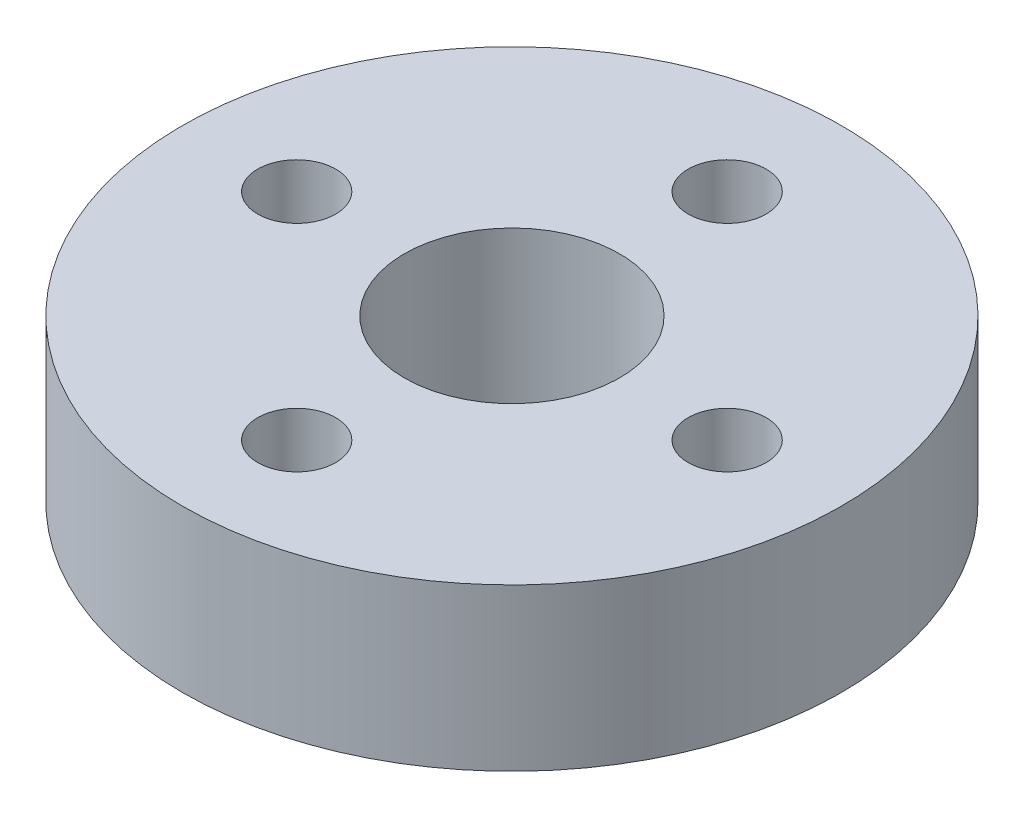
ISO-10303-21;
HEADER;
FILE_DESCRIPTION(('STEP AP214'),'2;1');
FILE_NAME('part.step','',(''),(''),'','','');
FILE_SCHEMA(('AUTOMOTIVE_DESIGN { 1 0 10303 214 1 1 1 1 }'));
ENDSEC;
DATA;
#1=APPLICATION_CONTEXT('core data for automotive mechanical design processes');
#2=APPLICATION_PROTOCOL_DEFINITION('international standard','automotive_design',2000,#1);
#3=PRODUCT_CONTEXT('',#1,'mechanical');
#4=PRODUCT('Part','Part','',(#3));
#5=PRODUCT_RELATED_PRODUCT_CATEGORY('part','',(#4));
#6=PRODUCT_DEFINITION_FORMATION('','',#4);
#7=PRODUCT_DEFINITION_CONTEXT('part definition',#1,'design');
#8=PRODUCT_DEFINITION('design','',#6,#7);
#9=PRODUCT_DEFINITION_SHAPE('','',#8);
#10=(LENGTH_UNIT() NAMED_UNIT(*) SI_UNIT(.MILLI.,.METRE.));
#11=(NAMED_UNIT(*) PLANE_ANGLE_UNIT() SI_UNIT($,.RADIAN.));
#12=(NAMED_UNIT(*) SI_UNIT($,.STERADIAN.) SOLID_ANGLE_UNIT());
#13=UNCERTAINTY_MEASURE_WITH_UNIT(LENGTH_MEASURE(1.E-05),#10,'distance_accuracy_value','');
#14=(GEOMETRIC_REPRESENTATION_CONTEXT(3) GLOBAL_UNCERTAINTY_ASSIGNED_CONTEXT((#13)) GLOBAL_UNIT_ASSIGNED_CONTEXT((#10,
#11,#12)) REPRESENTATION_CONTEXT('',''));
#15=CARTESIAN_POINT('',(0.,0.,0.));
#16=DIRECTION('',(0.,0.,1.));
#17=DIRECTION('',(1.,0.,0.));
#18=AXIS2_PLACEMENT_3D('',#15,#16,#17);
#19=CARTESIAN_POINT('',(0.,6.,0.));
#20=DIRECTION('',(0.,1.,0.));
#21=DIRECTION('',(0.,0.,1.));
#22=AXIS2_PLACEMENT_3D('',#19,#20,#21);
#23=PLANE('',#22);
#24=CARTESIAN_POINT('',(0.,6.,8.));
#25=DIRECTION('',(0.,1.,0.));
#26=DIRECTION('',(0.,0.,1.));
#27=AXIS2_PLACEMENT_3D('',#24,#25,#26);
#28=CIRCLE('',#27,1.45);
#29=CARTESIAN_POINT('',(0.,6.,9.45));
#30=VERTEX_POINT('',#29);
#31=EDGE_CURVE('E72',#30,#30,#28,.T.);
#32=ORIENTED_EDGE('',*,*,#31,.F.);
#33=EDGE_LOOP('',(#32));
#34=FACE_BOUND('',#33,.T.);
#35=CARTESIAN_POINT('',(0.,6.,-8.));
#36=DIRECTION('',(0.,1.,0.));
#37=DIRECTION('',(0.,0.,1.));
#38=AXIS2_PLACEMENT_3D('',#35,#36,#37);
#39=CIRCLE('',#38,1.45);
#40=CARTESIAN_POINT('',(0.,6.,-6.55));
#41=VERTEX_POINT('',#40);
#42=EDGE_CURVE('E56',#41,#41,#39,.T.);
#43=ORIENTED_EDGE('',*,*,#42,.F.);
#44=EDGE_LOOP('',(#43));
#45=FACE_BOUND('',#44,.T.);
#46=CARTESIAN_POINT('',(0.,6.,0.));
#47=DIRECTION('',(0.,1.,0.));
#48=DIRECTION('',(0.,0.,1.));
#49=AXIS2_PLACEMENT_3D('',#46,#47,#48);
#50=CIRCLE('',#49,12.25);
#51=CARTESIAN_POINT('',(0.,6.,12.25));
#52=VERTEX_POINT('',#51);
#53=EDGE_CURVE('E10',#52,#52,#50,.T.);
#54=ORIENTED_EDGE('',*,*,#53,.T.);
#55=EDGE_LOOP('',(#54));
#56=FACE_BOUND('',#55,.T.);
#57=CARTESIAN_POINT('',(0.,6.,0.));
#58=DIRECTION('',(0.,1.,0.));
#59=DIRECTION('',(0.,0.,1.));
#60=AXIS2_PLACEMENT_3D('',#57,#58,#59);
#61=CIRCLE('',#60,4.);
#62=CARTESIAN_POINT('',(0.,6.,4.));
#63=VERTEX_POINT('',#62);
#64=EDGE_CURVE('E50',#63,#63,#61,.T.);
#65=ORIENTED_EDGE('',*,*,#64,.F.);
#66=EDGE_LOOP('',(#65));
#67=FACE_BOUND('',#66,.T.);
#68=CARTESIAN_POINT('',(8.,6.,0.));
#69=DIRECTION('',(0.,1.,0.));
#70=DIRECTION('',(0.,0.,1.));
#71=AXIS2_PLACEMENT_3D('',#68,#69,#70);
#72=CIRCLE('',#71,1.45);
#73=CARTESIAN_POINT('',(8.,6.,1.45));
#74=VERTEX_POINT('',#73);
#75=EDGE_CURVE('E64',#74,#74,#72,.T.);
#76=ORIENTED_EDGE('',*,*,#75,.F.);
#77=EDGE_LOOP('',(#76));
#78=FACE_BOUND('',#77,.T.);
#79=CARTESIAN_POINT('',(-8.,6.,0.));
#80=DIRECTION('',(0.,1.,0.));
#81=DIRECTION('',(0.,0.,1.));
#82=AXIS2_PLACEMENT_3D('',#79,#80,#81);
#83=CIRCLE('',#82,1.45);
#84=CARTESIAN_POINT('',(-8.,6.,1.45));
#85=VERTEX_POINT('',#84);
#86=EDGE_CURVE('E80',#85,#85,#83,.T.);
#87=ORIENTED_EDGE('',*,*,#86,.F.);
#88=EDGE_LOOP('',(#87));
#89=FACE_BOUND('',#88,.T.);
#90=ADVANCED_FACE('F37',(#34,#45,#56,#67,#78,#89),#23,.T.);
#91=CARTESIAN_POINT('',(0.,0.,0.));
#92=DIRECTION('',(0.,1.,0.));
#93=DIRECTION('',(0.,0.,1.));
#94=AXIS2_PLACEMENT_3D('',#91,#92,#93);
#95=PLANE('',#94);
#96=CARTESIAN_POINT('',(0.,0.,0.));
#97=DIRECTION('',(0.,1.,0.));
#98=DIRECTION('',(0.,0.,1.));
#99=AXIS2_PLACEMENT_3D('',#96,#97,#98);
#100=CIRCLE('',#99,12.25);
#101=CARTESIAN_POINT('',(0.,0.,12.25));
#102=VERTEX_POINT('',#101);
#103=EDGE_CURVE('E41',#102,#102,#100,.T.);
#104=ORIENTED_EDGE('',*,*,#103,.F.);
#105=EDGE_LOOP('',(#104));
#106=FACE_BOUND('',#105,.T.);
#107=CARTESIAN_POINT('',(0.,0.,0.));
#108=DIRECTION('',(0.,1.,0.));
#109=DIRECTION('',(0.,0.,1.));
#110=AXIS2_PLACEMENT_3D('',#107,#108,#109);
#111=CIRCLE('',#110,4.);
#112=CARTESIAN_POINT('',(0.,0.,4.));
#113=VERTEX_POINT('',#112);
#114=EDGE_CURVE('E52',#113,#113,#111,.T.);
#115=ORIENTED_EDGE('',*,*,#114,.T.);
#116=EDGE_LOOP('',(#115));
#117=FACE_BOUND('',#116,.T.);
#118=CARTESIAN_POINT('',(0.,0.,-8.));
#119=DIRECTION('',(0.,1.,0.));
#120=DIRECTION('',(0.,0.,1.));
#121=AXIS2_PLACEMENT_3D('',#118,#119,#120);
#122=CIRCLE('',#121,1.45);
#123=CARTESIAN_POINT('',(0.,0.,-6.55));
#124=VERTEX_POINT('',#123);
#125=EDGE_CURVE('E60',#124,#124,#122,.T.);
#126=ORIENTED_EDGE('',*,*,#125,.T.);
#127=EDGE_LOOP('',(#126));
#128=FACE_BOUND('',#127,.T.);
#129=CARTESIAN_POINT('',(8.,0.,0.));
#130=DIRECTION('',(0.,1.,0.));
#131=DIRECTION('',(0.,0.,1.));
#132=AXIS2_PLACEMENT_3D('',#129,#130,#131);
#133=CIRCLE('',#132,1.45);
#134=CARTESIAN_POINT('',(8.,0.,1.45));
#135=VERTEX_POINT('',#134);
#136=EDGE_CURVE('E68',#135,#135,#133,.T.);
#137=ORIENTED_EDGE('',*,*,#136,.T.);
#138=EDGE_LOOP('',(#137));
#139=FACE_BOUND('',#138,.T.);
#140=CARTESIAN_POINT('',(0.,0.,8.));
#141=DIRECTION('',(0.,1.,0.));
#142=DIRECTION('',(0.,0.,1.));
#143=AXIS2_PLACEMENT_3D('',#140,#141,#142);
#144=CIRCLE('',#143,1.45);
#145=CARTESIAN_POINT('',(0.,0.,9.45));
#146=VERTEX_POINT('',#145);
#147=EDGE_CURVE('E76',#146,#146,#144,.T.);
#148=ORIENTED_EDGE('',*,*,#147,.T.);
#149=EDGE_LOOP('',(#148));
#150=FACE_BOUND('',#149,.T.);
#151=CARTESIAN_POINT('',(-8.,0.,0.));
#152=DIRECTION('',(0.,1.,0.));
#153=DIRECTION('',(0.,0.,1.));
#154=AXIS2_PLACEMENT_3D('',#151,#152,#153);
#155=CIRCLE('',#154,1.45);
#156=CARTESIAN_POINT('',(-8.,0.,1.45));
#157=VERTEX_POINT('',#156);
#158=EDGE_CURVE('E84',#157,#157,#155,.T.);
#159=ORIENTED_EDGE('',*,*,#158,.T.);
#160=EDGE_LOOP('',(#159));
#161=FACE_BOUND('',#160,.T.);
#162=ADVANCED_FACE('F96',(#106,#117,#128,#139,#150,#161),#95,.F.);
#163=CARTESIAN_POINT('',(0.,6.,0.));
#164=DIRECTION('',(0.,-1.,0.));
#165=DIRECTION('',(0.,0.,-1.));
#166=AXIS2_PLACEMENT_3D('',#163,#164,#165);
#167=CYLINDRICAL_SURFACE('',#166,12.25);
#168=ORIENTED_EDGE('',*,*,#53,.F.);
#169=EDGE_LOOP('',(#168));
#170=FACE_BOUND('',#169,.T.);
#171=ORIENTED_EDGE('',*,*,#103,.T.);
#172=EDGE_LOOP('',(#171));
#173=FACE_BOUND('',#172,.T.);
#174=ADVANCED_FACE('F39',(#170,#173),#167,.T.);
#175=CARTESIAN_POINT('',(0.,6.,0.));
#176=DIRECTION('',(0.,-1.,0.));
#177=DIRECTION('',(0.,0.,-1.));
#178=AXIS2_PLACEMENT_3D('',#175,#176,#177);
#179=CYLINDRICAL_SURFACE('',#178,4.);
#180=ORIENTED_EDGE('',*,*,#64,.T.);
#181=EDGE_LOOP('',(#180));
#182=FACE_BOUND('',#181,.T.);
#183=ORIENTED_EDGE('',*,*,#114,.F.);
#184=EDGE_LOOP('',(#183));
#185=FACE_BOUND('',#184,.T.);
#186=ADVANCED_FACE('F106',(#182,#185),#179,.F.);
#187=CARTESIAN_POINT('',(0.,6.,-8.));
#188=DIRECTION('',(0.,-1.,0.));
#189=DIRECTION('',(0.,0.,-1.));
#190=AXIS2_PLACEMENT_3D('',#187,#188,#189);
#191=CYLINDRICAL_SURFACE('',#190,1.45);
#192=ORIENTED_EDGE('',*,*,#42,.T.);
#193=EDGE_LOOP('',(#192));
#194=FACE_BOUND('',#193,.T.);
#195=ORIENTED_EDGE('',*,*,#125,.F.);
#196=EDGE_LOOP('',(#195));
#197=FACE_BOUND('',#196,.T.);
#198=ADVANCED_FACE('F109',(#194,#197),#191,.F.);
#199=CARTESIAN_POINT('',(8.,6.,0.));
#200=DIRECTION('',(0.,-1.,0.));
#201=DIRECTION('',(0.,0.,-1.));
#202=AXIS2_PLACEMENT_3D('',#199,#200,#201);
#203=CYLINDRICAL_SURFACE('',#202,1.45);
#204=ORIENTED_EDGE('',*,*,#75,.T.);
#205=EDGE_LOOP('',(#204));
#206=FACE_BOUND('',#205,.T.);
#207=ORIENTED_EDGE('',*,*,#136,.F.);
#208=EDGE_LOOP('',(#207));
#209=FACE_BOUND('',#208,.T.);
#210=ADVANCED_FACE('F113',(#206,#209),#203,.F.);
#211=CARTESIAN_POINT('',(0.,6.,8.));
#212=DIRECTION('',(0.,-1.,0.));
#213=DIRECTION('',(0.,0.,-1.));
#214=AXIS2_PLACEMENT_3D('',#211,#212,#213);
#215=CYLINDRICAL_SURFACE('',#214,1.45);
#216=ORIENTED_EDGE('',*,*,#31,.T.);
#217=EDGE_LOOP('',(#216));
#218=FACE_BOUND('',#217,.T.);
#219=ORIENTED_EDGE('',*,*,#147,.F.);
#220=EDGE_LOOP('',(#219));
#221=FACE_BOUND('',#220,.T.);
#222=ADVANCED_FACE('F117',(#218,#221),#215,.F.);
#223=CARTESIAN_POINT('',(-8.,6.,0.));
#224=DIRECTION('',(0.,-1.,0.));
#225=DIRECTION('',(0.,0.,-1.));
#226=AXIS2_PLACEMENT_3D('',#223,#224,#225);
#227=CYLINDRICAL_SURFACE('',#226,1.45);
#228=ORIENTED_EDGE('',*,*,#86,.T.);
#229=EDGE_LOOP('',(#228));
#230=FACE_BOUND('',#229,.T.);
#231=ORIENTED_EDGE('',*,*,#158,.F.);
#232=EDGE_LOOP('',(#231));
#233=FACE_BOUND('',#232,.T.);
#234=ADVANCED_FACE('F92',(#230,#233),#227,.F.);
#235=CLOSED_SHELL('',(#90,#162,#174,#186,#198,#210,#222,#234));
#236=MANIFOLD_SOLID_BREP('B2',#235);
#237=ADVANCED_BREP_SHAPE_REPRESENTATION('',(#18,#236),#14);
#238=SHAPE_DEFINITION_REPRESENTATION(#9,#237);
ENDSEC;
END-ISO-10303-21;
